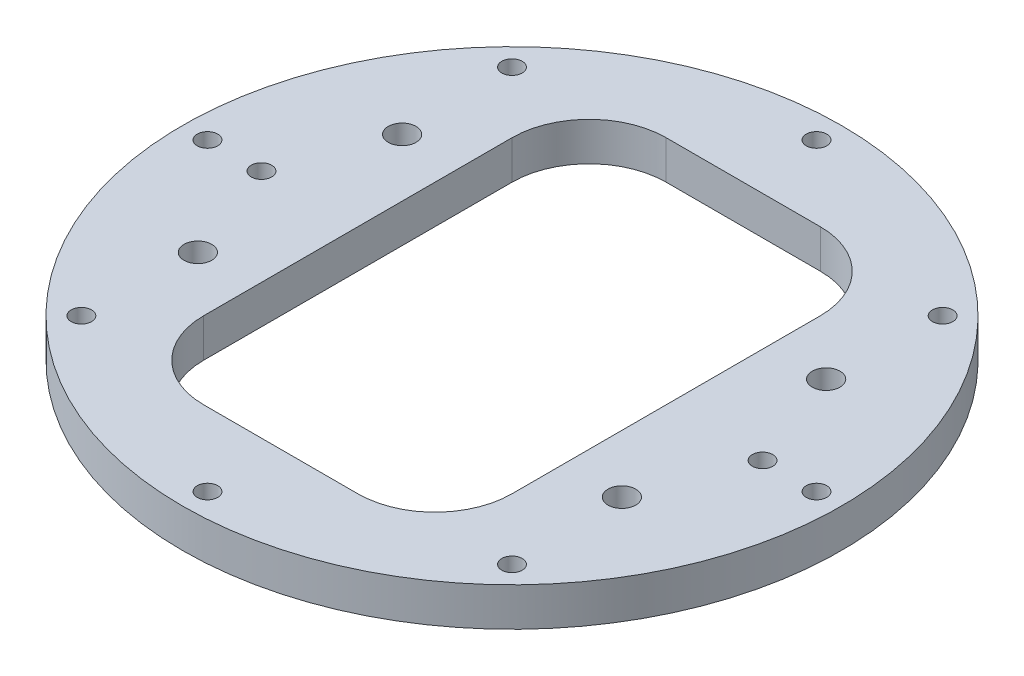
ISO-10303-21;
HEADER;
FILE_DESCRIPTION(('STEP AP214'),'2;1');
FILE_NAME('part.step','',(''),(''),'','','');
FILE_SCHEMA(('AUTOMOTIVE_DESIGN { 1 0 10303 214 1 1 1 1 }'));
ENDSEC;
DATA;
#1=APPLICATION_CONTEXT('core data for automotive mechanical design processes');
#2=APPLICATION_PROTOCOL_DEFINITION('international standard','automotive_design',2000,#1);
#3=PRODUCT_CONTEXT('',#1,'mechanical');
#4=PRODUCT('Part','Part','',(#3));
#5=PRODUCT_RELATED_PRODUCT_CATEGORY('part','',(#4));
#6=PRODUCT_DEFINITION_FORMATION('','',#4);
#7=PRODUCT_DEFINITION_CONTEXT('part definition',#1,'design');
#8=PRODUCT_DEFINITION('design','',#6,#7);
#9=PRODUCT_DEFINITION_SHAPE('','',#8);
#10=(LENGTH_UNIT() NAMED_UNIT(*) SI_UNIT(.MILLI.,.METRE.));
#11=(NAMED_UNIT(*) PLANE_ANGLE_UNIT() SI_UNIT($,.RADIAN.));
#12=(NAMED_UNIT(*) SI_UNIT($,.STERADIAN.) SOLID_ANGLE_UNIT());
#13=UNCERTAINTY_MEASURE_WITH_UNIT(LENGTH_MEASURE(1.E-05),#10,'distance_accuracy_value','');
#14=(GEOMETRIC_REPRESENTATION_CONTEXT(3) GLOBAL_UNCERTAINTY_ASSIGNED_CONTEXT((#13)) GLOBAL_UNIT_ASSIGNED_CONTEXT((#10,
#11,#12)) REPRESENTATION_CONTEXT('',''));
#15=CARTESIAN_POINT('',(0.,0.,0.));
#16=DIRECTION('',(0.,0.,1.));
#17=DIRECTION('',(1.,0.,0.));
#18=AXIS2_PLACEMENT_3D('',#15,#16,#17);
#19=CARTESIAN_POINT('',(0.,10.,0.));
#20=DIRECTION('',(0.,1.,0.));
#21=DIRECTION('',(0.,0.,1.));
#22=AXIS2_PLACEMENT_3D('',#19,#20,#21);
#23=PLANE('',#22);
#24=DIRECTION('',(0.,0.,-1.));
#25=VECTOR('',#24,1.);
#26=CARTESIAN_POINT('',(40.,10.,0.));
#27=LINE('',#26,#25);
#28=CARTESIAN_POINT('',(40.,10.,40.));
#29=VERTEX_POINT('',#28);
#30=CARTESIAN_POINT('',(40.,10.,-40.));
#31=VERTEX_POINT('',#30);
#32=EDGE_CURVE('E206',#29,#31,#27,.T.);
#33=ORIENTED_EDGE('',*,*,#32,.F.);
#34=CARTESIAN_POINT('',(20.,10.,40.));
#35=DIRECTION('',(0.,1.,0.));
#36=DIRECTION('',(0.,0.,1.));
#37=AXIS2_PLACEMENT_3D('',#34,#35,#36);
#38=CIRCLE('',#37,20.);
#39=CARTESIAN_POINT('',(20.,10.,60.));
#40=VERTEX_POINT('',#39);
#41=EDGE_CURVE('E119',#29,#40,#38,.F.);
#42=ORIENTED_EDGE('',*,*,#41,.T.);
#43=DIRECTION('',(1.,0.,0.));
#44=VECTOR('',#43,1.);
#45=CARTESIAN_POINT('',(-40.,10.,60.));
#46=LINE('',#45,#44);
#47=CARTESIAN_POINT('',(-20.,10.,60.));
#48=VERTEX_POINT('',#47);
#49=EDGE_CURVE('E169',#48,#40,#46,.T.);
#50=ORIENTED_EDGE('',*,*,#49,.F.);
#51=CARTESIAN_POINT('',(-20.,10.,40.));
#52=DIRECTION('',(0.,1.,0.));
#53=DIRECTION('',(0.,0.,1.));
#54=AXIS2_PLACEMENT_3D('',#51,#52,#53);
#55=CIRCLE('',#54,20.);
#56=CARTESIAN_POINT('',(-40.,10.,40.));
#57=VERTEX_POINT('',#56);
#58=EDGE_CURVE('E118',#48,#57,#55,.F.);
#59=ORIENTED_EDGE('',*,*,#58,.T.);
#60=DIRECTION('',(0.,0.,-1.));
#61=VECTOR('',#60,1.);
#62=CARTESIAN_POINT('',(-40.,10.,0.));
#63=LINE('',#62,#61);
#64=CARTESIAN_POINT('',(-40.,10.,-40.));
#65=VERTEX_POINT('',#64);
#66=EDGE_CURVE('E164',#57,#65,#63,.T.);
#67=ORIENTED_EDGE('',*,*,#66,.T.);
#68=CARTESIAN_POINT('',(-20.,10.,-40.));
#69=DIRECTION('',(0.,1.,0.));
#70=DIRECTION('',(0.,0.,1.));
#71=AXIS2_PLACEMENT_3D('',#68,#69,#70);
#72=CIRCLE('',#71,20.);
#73=CARTESIAN_POINT('',(-20.,10.,-60.));
#74=VERTEX_POINT('',#73);
#75=EDGE_CURVE('E50',#65,#74,#72,.F.);
#76=ORIENTED_EDGE('',*,*,#75,.T.);
#77=DIRECTION('',(-1.,0.,0.));
#78=VECTOR('',#77,1.);
#79=CARTESIAN_POINT('',(-40.,10.,-60.));
#80=LINE('',#79,#78);
#81=CARTESIAN_POINT('',(20.,10.,-60.));
#82=VERTEX_POINT('',#81);
#83=EDGE_CURVE('E162',#82,#74,#80,.T.);
#84=ORIENTED_EDGE('',*,*,#83,.F.);
#85=CARTESIAN_POINT('',(20.,10.,-40.));
#86=DIRECTION('',(0.,1.,0.));
#87=DIRECTION('',(0.,0.,1.));
#88=AXIS2_PLACEMENT_3D('',#85,#86,#87);
#89=CIRCLE('',#88,20.);
#90=EDGE_CURVE('E156',#82,#31,#89,.F.);
#91=ORIENTED_EDGE('',*,*,#90,.T.);
#92=EDGE_LOOP('',(#33,#42,#50,#59,#67,#76,#84,#91));
#93=FACE_BOUND('',#92,.T.);
#94=CARTESIAN_POINT('',(-65.,10.,4.44089209850063E-13));
#95=DIRECTION('',(0.,1.,0.));
#96=DIRECTION('',(0.,0.,1.));
#97=AXIS2_PLACEMENT_3D('',#94,#95,#96);
#98=CIRCLE('',#97,2.65);
#99=CARTESIAN_POINT('',(-65.,10.,2.65000000000044));
#100=VERTEX_POINT('',#99);
#101=EDGE_CURVE('E304',#100,#100,#98,.F.);
#102=ORIENTED_EDGE('',*,*,#101,.T.);
#103=EDGE_LOOP('',(#102));
#104=FACE_BOUND('',#103,.T.);
#105=CARTESIAN_POINT('',(-55.,10.,-26.5));
#106=DIRECTION('',(0.,-1.,0.));
#107=DIRECTION('',(0.,0.,-1.));
#108=AXIS2_PLACEMENT_3D('',#105,#106,#107);
#109=CIRCLE('',#108,3.60000000000002);
#110=CARTESIAN_POINT('',(-55.,10.,-30.1));
#111=VERTEX_POINT('',#110);
#112=EDGE_CURVE('E308',#111,#111,#109,.T.);
#113=ORIENTED_EDGE('',*,*,#112,.T.);
#114=EDGE_LOOP('',(#113));
#115=FACE_BOUND('',#114,.T.);
#116=CARTESIAN_POINT('',(55.,10.,26.5));
#117=DIRECTION('',(0.,1.,0.));
#118=DIRECTION('',(0.,0.,1.));
#119=AXIS2_PLACEMENT_3D('',#116,#117,#118);
#120=CIRCLE('',#119,3.6);
#121=CARTESIAN_POINT('',(55.,10.,30.1));
#122=VERTEX_POINT('',#121);
#123=EDGE_CURVE('E321',#122,#122,#120,.F.);
#124=ORIENTED_EDGE('',*,*,#123,.T.);
#125=EDGE_LOOP('',(#124));
#126=FACE_BOUND('',#125,.T.);
#127=CARTESIAN_POINT('',(0.,10.,-79.));
#128=DIRECTION('',(0.,1.,0.));
#129=DIRECTION('',(0.,0.,1.));
#130=AXIS2_PLACEMENT_3D('',#127,#128,#129);
#131=CIRCLE('',#130,2.65);
#132=CARTESIAN_POINT('',(0.,10.,-76.35));
#133=VERTEX_POINT('',#132);
#134=EDGE_CURVE('E210',#133,#133,#131,.T.);
#135=ORIENTED_EDGE('',*,*,#134,.F.);
#136=EDGE_LOOP('',(#135));
#137=FACE_BOUND('',#136,.T.);
#138=CARTESIAN_POINT('',(-55.8614357137366,10.,-55.8614357137379));
#139=DIRECTION('',(0.,1.,0.));
#140=DIRECTION('',(0.,0.,1.));
#141=AXIS2_PLACEMENT_3D('',#138,#139,#140);
#142=CIRCLE('',#141,2.65);
#143=CARTESIAN_POINT('',(-55.8614357137366,10.,-53.2114357137379));
#144=VERTEX_POINT('',#143);
#145=EDGE_CURVE('E218',#144,#144,#142,.T.);
#146=ORIENTED_EDGE('',*,*,#145,.F.);
#147=EDGE_LOOP('',(#146));
#148=FACE_BOUND('',#147,.T.);
#149=CARTESIAN_POINT('',(-79.,10.,-8.27481077305822E-13));
#150=DIRECTION('',(0.,1.,0.));
#151=DIRECTION('',(0.,0.,1.));
#152=AXIS2_PLACEMENT_3D('',#149,#150,#151);
#153=CIRCLE('',#152,2.65);
#154=CARTESIAN_POINT('',(-79.,10.,2.64999999999917));
#155=VERTEX_POINT('',#154);
#156=EDGE_CURVE('E221',#155,#155,#153,.T.);
#157=ORIENTED_EDGE('',*,*,#156,.F.);
#158=EDGE_LOOP('',(#157));
#159=FACE_BOUND('',#158,.T.);
#160=CARTESIAN_POINT('',(-55.8614357137377,10.,55.8614357137368));
#161=DIRECTION('',(0.,1.,0.));
#162=DIRECTION('',(0.,0.,1.));
#163=AXIS2_PLACEMENT_3D('',#160,#161,#162);
#164=CIRCLE('',#163,2.65);
#165=CARTESIAN_POINT('',(-55.8614357137377,10.,58.5114357137368));
#166=VERTEX_POINT('',#165);
#167=EDGE_CURVE('E224',#166,#166,#164,.T.);
#168=ORIENTED_EDGE('',*,*,#167,.F.);
#169=EDGE_LOOP('',(#168));
#170=FACE_BOUND('',#169,.T.);
#171=CARTESIAN_POINT('',(-5.51654051537215E-13,10.,79.));
#172=DIRECTION('',(0.,1.,0.));
#173=DIRECTION('',(0.,0.,1.));
#174=AXIS2_PLACEMENT_3D('',#171,#172,#173);
#175=CIRCLE('',#174,2.65);
#176=CARTESIAN_POINT('',(-5.51654051537215E-13,10.,81.65));
#177=VERTEX_POINT('',#176);
#178=EDGE_CURVE('E227',#177,#177,#175,.T.);
#179=ORIENTED_EDGE('',*,*,#178,.F.);
#180=EDGE_LOOP('',(#179));
#181=FACE_BOUND('',#180,.T.);
#182=CARTESIAN_POINT('',(55.861435713737,10.,55.8614357137375));
#183=DIRECTION('',(0.,1.,0.));
#184=DIRECTION('',(0.,0.,1.));
#185=AXIS2_PLACEMENT_3D('',#182,#183,#184);
#186=CIRCLE('',#185,2.65);
#187=CARTESIAN_POINT('',(55.861435713737,10.,58.5114357137375));
#188=VERTEX_POINT('',#187);
#189=EDGE_CURVE('E230',#188,#188,#186,.T.);
#190=ORIENTED_EDGE('',*,*,#189,.F.);
#191=EDGE_LOOP('',(#190));
#192=FACE_BOUND('',#191,.T.);
#193=CARTESIAN_POINT('',(79.,10.,2.75827025768607E-13));
#194=DIRECTION('',(0.,1.,0.));
#195=DIRECTION('',(0.,0.,1.));
#196=AXIS2_PLACEMENT_3D('',#193,#194,#195);
#197=CIRCLE('',#196,2.65);
#198=CARTESIAN_POINT('',(79.,10.,2.65000000000027));
#199=VERTEX_POINT('',#198);
#200=EDGE_CURVE('E233',#199,#199,#197,.T.);
#201=ORIENTED_EDGE('',*,*,#200,.F.);
#202=EDGE_LOOP('',(#201));
#203=FACE_BOUND('',#202,.T.);
#204=CARTESIAN_POINT('',(55.8614357137374,10.,-55.8614357137372));
#205=DIRECTION('',(0.,1.,0.));
#206=DIRECTION('',(0.,0.,1.));
#207=AXIS2_PLACEMENT_3D('',#204,#205,#206);
#208=CIRCLE('',#207,2.65);
#209=CARTESIAN_POINT('',(55.8614357137374,10.,-53.2114357137371));
#210=VERTEX_POINT('',#209);
#211=EDGE_CURVE('E236',#210,#210,#208,.T.);
#212=ORIENTED_EDGE('',*,*,#211,.F.);
#213=EDGE_LOOP('',(#212));
#214=FACE_BOUND('',#213,.T.);
#215=CARTESIAN_POINT('',(0.,10.,0.));
#216=DIRECTION('',(0.,1.,0.));
#217=DIRECTION('',(0.,0.,1.));
#218=AXIS2_PLACEMENT_3D('',#215,#216,#217);
#219=CIRCLE('',#218,85.5);
#220=CARTESIAN_POINT('',(0.,10.,85.5));
#221=VERTEX_POINT('',#220);
#222=EDGE_CURVE('E138',#221,#221,#219,.T.);
#223=ORIENTED_EDGE('',*,*,#222,.T.);
#224=EDGE_LOOP('',(#223));
#225=FACE_BOUND('',#224,.T.);
#226=CARTESIAN_POINT('',(65.,10.,0.));
#227=DIRECTION('',(0.,1.,0.));
#228=DIRECTION('',(0.,0.,1.));
#229=AXIS2_PLACEMENT_3D('',#226,#227,#228);
#230=CIRCLE('',#229,2.65);
#231=CARTESIAN_POINT('',(65.,10.,2.65));
#232=VERTEX_POINT('',#231);
#233=EDGE_CURVE('E315',#232,#232,#230,.T.);
#234=ORIENTED_EDGE('',*,*,#233,.F.);
#235=EDGE_LOOP('',(#234));
#236=FACE_BOUND('',#235,.T.);
#237=CARTESIAN_POINT('',(55.,10.,-26.5));
#238=DIRECTION('',(0.,1.,0.));
#239=DIRECTION('',(0.,0.,1.));
#240=AXIS2_PLACEMENT_3D('',#237,#238,#239);
#241=CIRCLE('',#240,3.6);
#242=CARTESIAN_POINT('',(55.,10.,-22.9));
#243=VERTEX_POINT('',#242);
#244=EDGE_CURVE('E330',#243,#243,#241,.T.);
#245=ORIENTED_EDGE('',*,*,#244,.F.);
#246=EDGE_LOOP('',(#245));
#247=FACE_BOUND('',#246,.T.);
#248=CARTESIAN_POINT('',(-55.,10.,26.5));
#249=DIRECTION('',(0.,1.,0.));
#250=DIRECTION('',(0.,0.,1.));
#251=AXIS2_PLACEMENT_3D('',#248,#249,#250);
#252=CIRCLE('',#251,3.6);
#253=CARTESIAN_POINT('',(-55.,10.,30.1));
#254=VERTEX_POINT('',#253);
#255=EDGE_CURVE('E307',#254,#254,#252,.T.);
#256=ORIENTED_EDGE('',*,*,#255,.F.);
#257=EDGE_LOOP('',(#256));
#258=FACE_BOUND('',#257,.T.);
#259=ADVANCED_FACE('F42',(#93,#104,#115,#126,#137,#148,#159,#170,#181,#192,#203,#214,#225,#236,
#247,#258),#23,.T.);
#260=CARTESIAN_POINT('',(0.,0.,0.));
#261=DIRECTION('',(0.,1.,0.));
#262=DIRECTION('',(0.,0.,1.));
#263=AXIS2_PLACEMENT_3D('',#260,#261,#262);
#264=PLANE('',#263);
#265=DIRECTION('',(0.,0.,-1.));
#266=VECTOR('',#265,1.);
#267=CARTESIAN_POINT('',(-40.,0.,0.));
#268=LINE('',#267,#266);
#269=CARTESIAN_POINT('',(-40.,0.,40.));
#270=VERTEX_POINT('',#269);
#271=CARTESIAN_POINT('',(-40.,0.,-40.));
#272=VERTEX_POINT('',#271);
#273=EDGE_CURVE('E129',#270,#272,#268,.T.);
#274=ORIENTED_EDGE('',*,*,#273,.F.);
#275=CARTESIAN_POINT('',(-20.,0.,40.));
#276=DIRECTION('',(0.,1.,0.));
#277=DIRECTION('',(0.,0.,1.));
#278=AXIS2_PLACEMENT_3D('',#275,#276,#277);
#279=CIRCLE('',#278,20.);
#280=CARTESIAN_POINT('',(-20.,0.,60.));
#281=VERTEX_POINT('',#280);
#282=EDGE_CURVE('E154',#270,#281,#279,.T.);
#283=ORIENTED_EDGE('',*,*,#282,.T.);
#284=DIRECTION('',(1.,0.,0.));
#285=VECTOR('',#284,1.);
#286=CARTESIAN_POINT('',(-40.,0.,60.));
#287=LINE('',#286,#285);
#288=CARTESIAN_POINT('',(20.,0.,60.));
#289=VERTEX_POINT('',#288);
#290=EDGE_CURVE('E114',#281,#289,#287,.T.);
#291=ORIENTED_EDGE('',*,*,#290,.T.);
#292=CARTESIAN_POINT('',(20.,0.,40.));
#293=DIRECTION('',(0.,1.,0.));
#294=DIRECTION('',(0.,0.,1.));
#295=AXIS2_PLACEMENT_3D('',#292,#293,#294);
#296=CIRCLE('',#295,20.);
#297=CARTESIAN_POINT('',(40.,0.,40.));
#298=VERTEX_POINT('',#297);
#299=EDGE_CURVE('E107',#289,#298,#296,.T.);
#300=ORIENTED_EDGE('',*,*,#299,.T.);
#301=DIRECTION('',(0.,0.,-1.));
#302=VECTOR('',#301,1.);
#303=CARTESIAN_POINT('',(40.,0.,0.));
#304=LINE('',#303,#302);
#305=CARTESIAN_POINT('',(40.,0.,-40.));
#306=VERTEX_POINT('',#305);
#307=EDGE_CURVE('E112',#298,#306,#304,.T.);
#308=ORIENTED_EDGE('',*,*,#307,.T.);
#309=CARTESIAN_POINT('',(20.,0.,-40.));
#310=DIRECTION('',(0.,1.,0.));
#311=DIRECTION('',(0.,0.,1.));
#312=AXIS2_PLACEMENT_3D('',#309,#310,#311);
#313=CIRCLE('',#312,20.);
#314=CARTESIAN_POINT('',(20.,0.,-60.));
#315=VERTEX_POINT('',#314);
#316=EDGE_CURVE('E64',#306,#315,#313,.T.);
#317=ORIENTED_EDGE('',*,*,#316,.T.);
#318=DIRECTION('',(-1.,0.,0.));
#319=VECTOR('',#318,1.);
#320=CARTESIAN_POINT('',(-40.,0.,-60.));
#321=LINE('',#320,#319);
#322=CARTESIAN_POINT('',(-20.,0.,-60.));
#323=VERTEX_POINT('',#322);
#324=EDGE_CURVE('E174',#315,#323,#321,.T.);
#325=ORIENTED_EDGE('',*,*,#324,.T.);
#326=CARTESIAN_POINT('',(-20.,0.,-40.));
#327=DIRECTION('',(0.,1.,0.));
#328=DIRECTION('',(0.,0.,1.));
#329=AXIS2_PLACEMENT_3D('',#326,#327,#328);
#330=CIRCLE('',#329,20.);
#331=EDGE_CURVE('E11',#323,#272,#330,.T.);
#332=ORIENTED_EDGE('',*,*,#331,.T.);
#333=EDGE_LOOP('',(#274,#283,#291,#300,#308,#317,#325,#332));
#334=FACE_BOUND('',#333,.T.);
#335=CARTESIAN_POINT('',(-65.,0.,4.44089209850063E-13));
#336=DIRECTION('',(0.,1.,0.));
#337=DIRECTION('',(0.,0.,1.));
#338=AXIS2_PLACEMENT_3D('',#335,#336,#337);
#339=CIRCLE('',#338,2.65);
#340=CARTESIAN_POINT('',(-65.,0.,2.65000000000044));
#341=VERTEX_POINT('',#340);
#342=EDGE_CURVE('E130',#341,#341,#339,.F.);
#343=ORIENTED_EDGE('',*,*,#342,.F.);
#344=EDGE_LOOP('',(#343));
#345=FACE_BOUND('',#344,.T.);
#346=CARTESIAN_POINT('',(-55.,0.,-26.5));
#347=DIRECTION('',(0.,-1.,0.));
#348=DIRECTION('',(0.,0.,-1.));
#349=AXIS2_PLACEMENT_3D('',#346,#347,#348);
#350=CIRCLE('',#349,3.60000000000002);
#351=CARTESIAN_POINT('',(-55.,0.,-30.1));
#352=VERTEX_POINT('',#351);
#353=EDGE_CURVE('E312',#352,#352,#350,.T.);
#354=ORIENTED_EDGE('',*,*,#353,.F.);
#355=EDGE_LOOP('',(#354));
#356=FACE_BOUND('',#355,.T.);
#357=CARTESIAN_POINT('',(55.,0.,-26.5));
#358=DIRECTION('',(0.,1.,0.));
#359=DIRECTION('',(0.,0.,1.));
#360=AXIS2_PLACEMENT_3D('',#357,#358,#359);
#361=CIRCLE('',#360,3.6);
#362=CARTESIAN_POINT('',(55.,0.,-22.9));
#363=VERTEX_POINT('',#362);
#364=EDGE_CURVE('E213',#363,#363,#361,.T.);
#365=ORIENTED_EDGE('',*,*,#364,.T.);
#366=EDGE_LOOP('',(#365));
#367=FACE_BOUND('',#366,.T.);
#368=CARTESIAN_POINT('',(0.,0.,0.));
#369=DIRECTION('',(0.,1.,0.));
#370=DIRECTION('',(0.,0.,1.));
#371=AXIS2_PLACEMENT_3D('',#368,#369,#370);
#372=CIRCLE('',#371,85.5);
#373=CARTESIAN_POINT('',(0.,0.,85.5));
#374=VERTEX_POINT('',#373);
#375=EDGE_CURVE('E204',#374,#374,#372,.T.);
#376=ORIENTED_EDGE('',*,*,#375,.F.);
#377=EDGE_LOOP('',(#376));
#378=FACE_BOUND('',#377,.T.);
#379=CARTESIAN_POINT('',(55.8614357137374,0.,-55.8614357137372));
#380=DIRECTION('',(0.,1.,0.));
#381=DIRECTION('',(0.,0.,1.));
#382=AXIS2_PLACEMENT_3D('',#379,#380,#381);
#383=CIRCLE('',#382,2.65);
#384=CARTESIAN_POINT('',(55.8614357137374,0.,-53.2114357137371));
#385=VERTEX_POINT('',#384);
#386=EDGE_CURVE('E202',#385,#385,#383,.T.);
#387=ORIENTED_EDGE('',*,*,#386,.T.);
#388=EDGE_LOOP('',(#387));
#389=FACE_BOUND('',#388,.T.);
#390=CARTESIAN_POINT('',(79.,0.,2.75827025768607E-13));
#391=DIRECTION('',(0.,1.,0.));
#392=DIRECTION('',(0.,0.,1.));
#393=AXIS2_PLACEMENT_3D('',#390,#391,#392);
#394=CIRCLE('',#393,2.65);
#395=CARTESIAN_POINT('',(79.,0.,2.65000000000027));
#396=VERTEX_POINT('',#395);
#397=EDGE_CURVE('E199',#396,#396,#394,.T.);
#398=ORIENTED_EDGE('',*,*,#397,.T.);
#399=EDGE_LOOP('',(#398));
#400=FACE_BOUND('',#399,.T.);
#401=CARTESIAN_POINT('',(55.861435713737,0.,55.8614357137375));
#402=DIRECTION('',(0.,1.,0.));
#403=DIRECTION('',(0.,0.,1.));
#404=AXIS2_PLACEMENT_3D('',#401,#402,#403);
#405=CIRCLE('',#404,2.65);
#406=CARTESIAN_POINT('',(55.861435713737,0.,58.5114357137375));
#407=VERTEX_POINT('',#406);
#408=EDGE_CURVE('E196',#407,#407,#405,.T.);
#409=ORIENTED_EDGE('',*,*,#408,.T.);
#410=EDGE_LOOP('',(#409));
#411=FACE_BOUND('',#410,.T.);
#412=CARTESIAN_POINT('',(-5.51654051537215E-13,0.,79.));
#413=DIRECTION('',(0.,1.,0.));
#414=DIRECTION('',(0.,0.,1.));
#415=AXIS2_PLACEMENT_3D('',#412,#413,#414);
#416=CIRCLE('',#415,2.65);
#417=CARTESIAN_POINT('',(-5.51654051537215E-13,0.,81.65));
#418=VERTEX_POINT('',#417);
#419=EDGE_CURVE('E193',#418,#418,#416,.T.);
#420=ORIENTED_EDGE('',*,*,#419,.T.);
#421=EDGE_LOOP('',(#420));
#422=FACE_BOUND('',#421,.T.);
#423=CARTESIAN_POINT('',(-55.8614357137377,0.,55.8614357137368));
#424=DIRECTION('',(0.,1.,0.));
#425=DIRECTION('',(0.,0.,1.));
#426=AXIS2_PLACEMENT_3D('',#423,#424,#425);
#427=CIRCLE('',#426,2.65);
#428=CARTESIAN_POINT('',(-55.8614357137377,0.,58.5114357137368));
#429=VERTEX_POINT('',#428);
#430=EDGE_CURVE('E190',#429,#429,#427,.T.);
#431=ORIENTED_EDGE('',*,*,#430,.T.);
#432=EDGE_LOOP('',(#431));
#433=FACE_BOUND('',#432,.T.);
#434=CARTESIAN_POINT('',(-79.,0.,-8.27481077305822E-13));
#435=DIRECTION('',(0.,1.,0.));
#436=DIRECTION('',(0.,0.,1.));
#437=AXIS2_PLACEMENT_3D('',#434,#435,#436);
#438=CIRCLE('',#437,2.65);
#439=CARTESIAN_POINT('',(-79.,0.,2.64999999999917));
#440=VERTEX_POINT('',#439);
#441=EDGE_CURVE('E187',#440,#440,#438,.T.);
#442=ORIENTED_EDGE('',*,*,#441,.T.);
#443=EDGE_LOOP('',(#442));
#444=FACE_BOUND('',#443,.T.);
#445=CARTESIAN_POINT('',(-55.8614357137366,0.,-55.8614357137379));
#446=DIRECTION('',(0.,1.,0.));
#447=DIRECTION('',(0.,0.,1.));
#448=AXIS2_PLACEMENT_3D('',#445,#446,#447);
#449=CIRCLE('',#448,2.65);
#450=CARTESIAN_POINT('',(-55.8614357137366,0.,-53.2114357137379));
#451=VERTEX_POINT('',#450);
#452=EDGE_CURVE('E181',#451,#451,#449,.T.);
#453=ORIENTED_EDGE('',*,*,#452,.T.);
#454=EDGE_LOOP('',(#453));
#455=FACE_BOUND('',#454,.T.);
#456=CARTESIAN_POINT('',(0.,0.,-79.));
#457=DIRECTION('',(0.,1.,0.));
#458=DIRECTION('',(0.,0.,1.));
#459=AXIS2_PLACEMENT_3D('',#456,#457,#458);
#460=CIRCLE('',#459,2.65);
#461=CARTESIAN_POINT('',(0.,0.,-76.35));
#462=VERTEX_POINT('',#461);
#463=EDGE_CURVE('E178',#462,#462,#460,.T.);
#464=ORIENTED_EDGE('',*,*,#463,.T.);
#465=EDGE_LOOP('',(#464));
#466=FACE_BOUND('',#465,.T.);
#467=CARTESIAN_POINT('',(55.,0.,26.5));
#468=DIRECTION('',(0.,1.,0.));
#469=DIRECTION('',(0.,0.,1.));
#470=AXIS2_PLACEMENT_3D('',#467,#468,#469);
#471=CIRCLE('',#470,3.6);
#472=CARTESIAN_POINT('',(55.,0.,30.1));
#473=VERTEX_POINT('',#472);
#474=EDGE_CURVE('E311',#473,#473,#471,.F.);
#475=ORIENTED_EDGE('',*,*,#474,.F.);
#476=EDGE_LOOP('',(#475));
#477=FACE_BOUND('',#476,.T.);
#478=CARTESIAN_POINT('',(65.,0.,0.));
#479=DIRECTION('',(0.,1.,0.));
#480=DIRECTION('',(0.,0.,1.));
#481=AXIS2_PLACEMENT_3D('',#478,#479,#480);
#482=CIRCLE('',#481,2.65);
#483=CARTESIAN_POINT('',(65.,0.,2.65));
#484=VERTEX_POINT('',#483);
#485=EDGE_CURVE('E318',#484,#484,#482,.T.);
#486=ORIENTED_EDGE('',*,*,#485,.T.);
#487=EDGE_LOOP('',(#486));
#488=FACE_BOUND('',#487,.T.);
#489=CARTESIAN_POINT('',(-55.,0.,26.5));
#490=DIRECTION('',(0.,1.,0.));
#491=DIRECTION('',(0.,0.,1.));
#492=AXIS2_PLACEMENT_3D('',#489,#490,#491);
#493=CIRCLE('',#492,3.6);
#494=CARTESIAN_POINT('',(-55.,0.,30.1));
#495=VERTEX_POINT('',#494);
#496=EDGE_CURVE('E328',#495,#495,#493,.T.);
#497=ORIENTED_EDGE('',*,*,#496,.T.);
#498=EDGE_LOOP('',(#497));
#499=FACE_BOUND('',#498,.T.);
#500=ADVANCED_FACE('F110',(#334,#345,#356,#367,#378,#389,#400,#411,#422,#433,#444,#455,#466,
#477,#488,#499),#264,.F.);
#501=CARTESIAN_POINT('',(40.,10.,0.));
#502=DIRECTION('',(-1.,0.,0.));
#503=DIRECTION('',(0.,0.,1.));
#504=AXIS2_PLACEMENT_3D('',#501,#502,#503);
#505=PLANE('',#504);
#506=ORIENTED_EDGE('',*,*,#307,.F.);
#507=DIRECTION('',(0.,1.,0.));
#508=VECTOR('',#507,1.);
#509=CARTESIAN_POINT('',(40.,10.,40.));
#510=LINE('',#509,#508);
#511=EDGE_CURVE('E125',#298,#29,#510,.T.);
#512=ORIENTED_EDGE('',*,*,#511,.T.);
#513=ORIENTED_EDGE('',*,*,#32,.T.);
#514=DIRECTION('',(0.,1.,0.));
#515=VECTOR('',#514,1.);
#516=CARTESIAN_POINT('',(40.,10.,-40.));
#517=LINE('',#516,#515);
#518=EDGE_CURVE('E128',#31,#306,#517,.F.);
#519=ORIENTED_EDGE('',*,*,#518,.T.);
#520=EDGE_LOOP('',(#506,#512,#513,#519));
#521=FACE_BOUND('',#520,.T.);
#522=ADVANCED_FACE('F123',(#521),#505,.T.);
#523=CARTESIAN_POINT('',(-40.,10.,0.));
#524=DIRECTION('',(-1.,0.,0.));
#525=DIRECTION('',(0.,0.,1.));
#526=AXIS2_PLACEMENT_3D('',#523,#524,#525);
#527=PLANE('',#526);
#528=ORIENTED_EDGE('',*,*,#66,.F.);
#529=DIRECTION('',(0.,1.,0.));
#530=VECTOR('',#529,1.);
#531=CARTESIAN_POINT('',(-40.,0.,40.));
#532=LINE('',#531,#530);
#533=EDGE_CURVE('E146',#57,#270,#532,.F.);
#534=ORIENTED_EDGE('',*,*,#533,.T.);
#535=ORIENTED_EDGE('',*,*,#273,.T.);
#536=DIRECTION('',(0.,1.,0.));
#537=VECTOR('',#536,1.);
#538=CARTESIAN_POINT('',(-40.,10.,-40.));
#539=LINE('',#538,#537);
#540=EDGE_CURVE('E143',#272,#65,#539,.T.);
#541=ORIENTED_EDGE('',*,*,#540,.T.);
#542=EDGE_LOOP('',(#528,#534,#535,#541));
#543=FACE_BOUND('',#542,.T.);
#544=ADVANCED_FACE('F176',(#543),#527,.F.);
#545=CARTESIAN_POINT('',(55.8614357137374,10.,-55.8614357137372));
#546=DIRECTION('',(0.,-1.,0.));
#547=DIRECTION('',(0.,0.,-1.));
#548=AXIS2_PLACEMENT_3D('',#545,#546,#547);
#549=CYLINDRICAL_SURFACE('',#548,2.65);
#550=ORIENTED_EDGE('',*,*,#211,.T.);
#551=EDGE_LOOP('',(#550));
#552=FACE_BOUND('',#551,.T.);
#553=ORIENTED_EDGE('',*,*,#386,.F.);
#554=EDGE_LOOP('',(#553));
#555=FACE_BOUND('',#554,.T.);
#556=ADVANCED_FACE('F386',(#552,#555),#549,.F.);
#557=CARTESIAN_POINT('',(79.,10.,2.75827025768607E-13));
#558=DIRECTION('',(0.,-1.,0.));
#559=DIRECTION('',(0.,0.,-1.));
#560=AXIS2_PLACEMENT_3D('',#557,#558,#559);
#561=CYLINDRICAL_SURFACE('',#560,2.65);
#562=ORIENTED_EDGE('',*,*,#200,.T.);
#563=EDGE_LOOP('',(#562));
#564=FACE_BOUND('',#563,.T.);
#565=ORIENTED_EDGE('',*,*,#397,.F.);
#566=EDGE_LOOP('',(#565));
#567=FACE_BOUND('',#566,.T.);
#568=ADVANCED_FACE('F389',(#564,#567),#561,.F.);
#569=CARTESIAN_POINT('',(55.861435713737,10.,55.8614357137375));
#570=DIRECTION('',(0.,-1.,0.));
#571=DIRECTION('',(0.,0.,-1.));
#572=AXIS2_PLACEMENT_3D('',#569,#570,#571);
#573=CYLINDRICAL_SURFACE('',#572,2.65);
#574=ORIENTED_EDGE('',*,*,#189,.T.);
#575=EDGE_LOOP('',(#574));
#576=FACE_BOUND('',#575,.T.);
#577=ORIENTED_EDGE('',*,*,#408,.F.);
#578=EDGE_LOOP('',(#577));
#579=FACE_BOUND('',#578,.T.);
#580=ADVANCED_FACE('F393',(#576,#579),#573,.F.);
#581=CARTESIAN_POINT('',(-5.51654051537215E-13,10.,79.));
#582=DIRECTION('',(0.,-1.,0.));
#583=DIRECTION('',(0.,0.,-1.));
#584=AXIS2_PLACEMENT_3D('',#581,#582,#583);
#585=CYLINDRICAL_SURFACE('',#584,2.65);
#586=ORIENTED_EDGE('',*,*,#178,.T.);
#587=EDGE_LOOP('',(#586));
#588=FACE_BOUND('',#587,.T.);
#589=ORIENTED_EDGE('',*,*,#419,.F.);
#590=EDGE_LOOP('',(#589));
#591=FACE_BOUND('',#590,.T.);
#592=ADVANCED_FACE('F401',(#588,#591),#585,.F.);
#593=CARTESIAN_POINT('',(-55.8614357137377,10.,55.8614357137368));
#594=DIRECTION('',(0.,-1.,0.));
#595=DIRECTION('',(0.,0.,-1.));
#596=AXIS2_PLACEMENT_3D('',#593,#594,#595);
#597=CYLINDRICAL_SURFACE('',#596,2.65);
#598=ORIENTED_EDGE('',*,*,#167,.T.);
#599=EDGE_LOOP('',(#598));
#600=FACE_BOUND('',#599,.T.);
#601=ORIENTED_EDGE('',*,*,#430,.F.);
#602=EDGE_LOOP('',(#601));
#603=FACE_BOUND('',#602,.T.);
#604=ADVANCED_FACE('F405',(#600,#603),#597,.F.);
#605=CARTESIAN_POINT('',(-79.,10.,-8.27481077305822E-13));
#606=DIRECTION('',(0.,-1.,0.));
#607=DIRECTION('',(0.,0.,-1.));
#608=AXIS2_PLACEMENT_3D('',#605,#606,#607);
#609=CYLINDRICAL_SURFACE('',#608,2.65);
#610=ORIENTED_EDGE('',*,*,#156,.T.);
#611=EDGE_LOOP('',(#610));
#612=FACE_BOUND('',#611,.T.);
#613=ORIENTED_EDGE('',*,*,#441,.F.);
#614=EDGE_LOOP('',(#613));
#615=FACE_BOUND('',#614,.T.);
#616=ADVANCED_FACE('F409',(#612,#615),#609,.F.);
#617=CARTESIAN_POINT('',(-55.8614357137366,10.,-55.8614357137379));
#618=DIRECTION('',(0.,-1.,0.));
#619=DIRECTION('',(0.,0.,-1.));
#620=AXIS2_PLACEMENT_3D('',#617,#618,#619);
#621=CYLINDRICAL_SURFACE('',#620,2.65);
#622=ORIENTED_EDGE('',*,*,#145,.T.);
#623=EDGE_LOOP('',(#622));
#624=FACE_BOUND('',#623,.T.);
#625=ORIENTED_EDGE('',*,*,#452,.F.);
#626=EDGE_LOOP('',(#625));
#627=FACE_BOUND('',#626,.T.);
#628=ADVANCED_FACE('F255',(#624,#627),#621,.F.);
#629=CARTESIAN_POINT('',(0.,10.,-79.));
#630=DIRECTION('',(0.,-1.,0.));
#631=DIRECTION('',(0.,0.,-1.));
#632=AXIS2_PLACEMENT_3D('',#629,#630,#631);
#633=CYLINDRICAL_SURFACE('',#632,2.65);
#634=ORIENTED_EDGE('',*,*,#134,.T.);
#635=EDGE_LOOP('',(#634));
#636=FACE_BOUND('',#635,.T.);
#637=ORIENTED_EDGE('',*,*,#463,.F.);
#638=EDGE_LOOP('',(#637));
#639=FACE_BOUND('',#638,.T.);
#640=ADVANCED_FACE('F246',(#636,#639),#633,.F.);
#641=CARTESIAN_POINT('',(0.,10.,0.));
#642=DIRECTION('',(0.,-1.,0.));
#643=DIRECTION('',(0.,0.,-1.));
#644=AXIS2_PLACEMENT_3D('',#641,#642,#643);
#645=CYLINDRICAL_SURFACE('',#644,85.5);
#646=ORIENTED_EDGE('',*,*,#222,.F.);
#647=EDGE_LOOP('',(#646));
#648=FACE_BOUND('',#647,.T.);
#649=ORIENTED_EDGE('',*,*,#375,.T.);
#650=EDGE_LOOP('',(#649));
#651=FACE_BOUND('',#650,.T.);
#652=ADVANCED_FACE('F243',(#648,#651),#645,.T.);
#653=CARTESIAN_POINT('',(55.,0.,26.5));
#654=DIRECTION('',(0.,1.,0.));
#655=DIRECTION('',(0.,0.,1.));
#656=AXIS2_PLACEMENT_3D('',#653,#654,#655);
#657=CYLINDRICAL_SURFACE('',#656,3.6);
#658=ORIENTED_EDGE('',*,*,#474,.T.);
#659=EDGE_LOOP('',(#658));
#660=FACE_BOUND('',#659,.T.);
#661=ORIENTED_EDGE('',*,*,#123,.F.);
#662=EDGE_LOOP('',(#661));
#663=FACE_BOUND('',#662,.T.);
#664=ADVANCED_FACE('F245',(#660,#663),#657,.F.);
#665=CARTESIAN_POINT('',(65.,0.,0.));
#666=DIRECTION('',(0.,1.,0.));
#667=DIRECTION('',(0.,0.,1.));
#668=AXIS2_PLACEMENT_3D('',#665,#666,#667);
#669=CYLINDRICAL_SURFACE('',#668,2.65);
#670=ORIENTED_EDGE('',*,*,#485,.F.);
#671=EDGE_LOOP('',(#670));
#672=FACE_BOUND('',#671,.T.);
#673=ORIENTED_EDGE('',*,*,#233,.T.);
#674=EDGE_LOOP('',(#673));
#675=FACE_BOUND('',#674,.T.);
#676=ADVANCED_FACE('F252',(#672,#675),#669,.F.);
#677=CARTESIAN_POINT('',(55.,0.,-26.5));
#678=DIRECTION('',(0.,1.,0.));
#679=DIRECTION('',(0.,0.,1.));
#680=AXIS2_PLACEMENT_3D('',#677,#678,#679);
#681=CYLINDRICAL_SURFACE('',#680,3.6);
#682=ORIENTED_EDGE('',*,*,#364,.F.);
#683=EDGE_LOOP('',(#682));
#684=FACE_BOUND('',#683,.T.);
#685=ORIENTED_EDGE('',*,*,#244,.T.);
#686=EDGE_LOOP('',(#685));
#687=FACE_BOUND('',#686,.T.);
#688=ADVANCED_FACE('F267',(#684,#687),#681,.F.);
#689=CARTESIAN_POINT('',(-55.,0.,26.5));
#690=DIRECTION('',(0.,1.,0.));
#691=DIRECTION('',(0.,0.,1.));
#692=AXIS2_PLACEMENT_3D('',#689,#690,#691);
#693=CYLINDRICAL_SURFACE('',#692,3.6);
#694=ORIENTED_EDGE('',*,*,#496,.F.);
#695=EDGE_LOOP('',(#694));
#696=FACE_BOUND('',#695,.T.);
#697=ORIENTED_EDGE('',*,*,#255,.T.);
#698=EDGE_LOOP('',(#697));
#699=FACE_BOUND('',#698,.T.);
#700=ADVANCED_FACE('F270',(#696,#699),#693,.F.);
#701=CARTESIAN_POINT('',(-55.,0.,-26.5));
#702=DIRECTION('',(0.,1.,0.));
#703=DIRECTION('',(0.,0.,1.));
#704=AXIS2_PLACEMENT_3D('',#701,#702,#703);
#705=CYLINDRICAL_SURFACE('',#704,3.60000000000002);
#706=ORIENTED_EDGE('',*,*,#353,.T.);
#707=EDGE_LOOP('',(#706));
#708=FACE_BOUND('',#707,.T.);
#709=ORIENTED_EDGE('',*,*,#112,.F.);
#710=EDGE_LOOP('',(#709));
#711=FACE_BOUND('',#710,.T.);
#712=ADVANCED_FACE('F273',(#708,#711),#705,.F.);
#713=CARTESIAN_POINT('',(-65.,0.,4.44089209850063E-13));
#714=DIRECTION('',(0.,1.,0.));
#715=DIRECTION('',(0.,0.,1.));
#716=AXIS2_PLACEMENT_3D('',#713,#714,#715);
#717=CYLINDRICAL_SURFACE('',#716,2.65);
#718=ORIENTED_EDGE('',*,*,#342,.T.);
#719=EDGE_LOOP('',(#718));
#720=FACE_BOUND('',#719,.T.);
#721=ORIENTED_EDGE('',*,*,#101,.F.);
#722=EDGE_LOOP('',(#721));
#723=FACE_BOUND('',#722,.T.);
#724=ADVANCED_FACE('F281',(#720,#723),#717,.F.);
#725=CARTESIAN_POINT('',(-40.,0.,-60.));
#726=DIRECTION('',(0.,0.,-1.));
#727=DIRECTION('',(-1.,0.,0.));
#728=AXIS2_PLACEMENT_3D('',#725,#726,#727);
#729=PLANE('',#728);
#730=ORIENTED_EDGE('',*,*,#324,.F.);
#731=DIRECTION('',(0.,1.,0.));
#732=VECTOR('',#731,1.);
#733=CARTESIAN_POINT('',(20.,0.,-60.));
#734=LINE('',#733,#732);
#735=EDGE_CURVE('E149',#315,#82,#734,.T.);
#736=ORIENTED_EDGE('',*,*,#735,.T.);
#737=ORIENTED_EDGE('',*,*,#83,.T.);
#738=DIRECTION('',(0.,1.,0.));
#739=VECTOR('',#738,1.);
#740=CARTESIAN_POINT('',(-20.,0.,-60.));
#741=LINE('',#740,#739);
#742=EDGE_CURVE('E57',#74,#323,#741,.F.);
#743=ORIENTED_EDGE('',*,*,#742,.T.);
#744=EDGE_LOOP('',(#730,#736,#737,#743));
#745=FACE_BOUND('',#744,.T.);
#746=ADVANCED_FACE('F167',(#745),#729,.F.);
#747=CARTESIAN_POINT('',(-40.,0.,60.));
#748=DIRECTION('',(0.,0.,1.));
#749=DIRECTION('',(1.,0.,0.));
#750=AXIS2_PLACEMENT_3D('',#747,#748,#749);
#751=PLANE('',#750);
#752=ORIENTED_EDGE('',*,*,#49,.T.);
#753=DIRECTION('',(0.,1.,0.));
#754=VECTOR('',#753,1.);
#755=CARTESIAN_POINT('',(20.,0.,60.));
#756=LINE('',#755,#754);
#757=EDGE_CURVE('E136',#40,#289,#756,.F.);
#758=ORIENTED_EDGE('',*,*,#757,.T.);
#759=ORIENTED_EDGE('',*,*,#290,.F.);
#760=DIRECTION('',(0.,1.,0.));
#761=VECTOR('',#760,1.);
#762=CARTESIAN_POINT('',(-20.,10.,60.));
#763=LINE('',#762,#761);
#764=EDGE_CURVE('E133',#281,#48,#763,.T.);
#765=ORIENTED_EDGE('',*,*,#764,.T.);
#766=EDGE_LOOP('',(#752,#758,#759,#765));
#767=FACE_BOUND('',#766,.T.);
#768=ADVANCED_FACE('F287',(#767),#751,.F.);
#769=CARTESIAN_POINT('',(20.,10.,40.));
#770=DIRECTION('',(0.,1.,0.));
#771=DIRECTION('',(0.,0.,1.));
#772=AXIS2_PLACEMENT_3D('',#769,#770,#771);
#773=CYLINDRICAL_SURFACE('',#772,20.);
#774=ORIENTED_EDGE('',*,*,#299,.F.);
#775=ORIENTED_EDGE('',*,*,#757,.F.);
#776=ORIENTED_EDGE('',*,*,#41,.F.);
#777=ORIENTED_EDGE('',*,*,#511,.F.);
#778=EDGE_LOOP('',(#774,#775,#776,#777));
#779=FACE_BOUND('',#778,.T.);
#780=ADVANCED_FACE('F132',(#779),#773,.F.);
#781=CARTESIAN_POINT('',(-20.,0.,40.));
#782=DIRECTION('',(0.,-1.,0.));
#783=DIRECTION('',(0.,0.,-1.));
#784=AXIS2_PLACEMENT_3D('',#781,#782,#783);
#785=CYLINDRICAL_SURFACE('',#784,20.);
#786=ORIENTED_EDGE('',*,*,#282,.F.);
#787=ORIENTED_EDGE('',*,*,#533,.F.);
#788=ORIENTED_EDGE('',*,*,#58,.F.);
#789=ORIENTED_EDGE('',*,*,#764,.F.);
#790=EDGE_LOOP('',(#786,#787,#788,#789));
#791=FACE_BOUND('',#790,.T.);
#792=ADVANCED_FACE('F293',(#791),#785,.F.);
#793=CARTESIAN_POINT('',(20.,0.,-40.));
#794=DIRECTION('',(0.,1.,0.));
#795=DIRECTION('',(0.,0.,1.));
#796=AXIS2_PLACEMENT_3D('',#793,#794,#795);
#797=CYLINDRICAL_SURFACE('',#796,20.);
#798=ORIENTED_EDGE('',*,*,#316,.F.);
#799=ORIENTED_EDGE('',*,*,#518,.F.);
#800=ORIENTED_EDGE('',*,*,#90,.F.);
#801=ORIENTED_EDGE('',*,*,#735,.F.);
#802=EDGE_LOOP('',(#798,#799,#800,#801));
#803=FACE_BOUND('',#802,.T.);
#804=ADVANCED_FACE('F420',(#803),#797,.F.);
#805=CARTESIAN_POINT('',(-20.,10.,-40.));
#806=DIRECTION('',(0.,-1.,0.));
#807=DIRECTION('',(0.,0.,-1.));
#808=AXIS2_PLACEMENT_3D('',#805,#806,#807);
#809=CYLINDRICAL_SURFACE('',#808,20.);
#810=ORIENTED_EDGE('',*,*,#331,.F.);
#811=ORIENTED_EDGE('',*,*,#742,.F.);
#812=ORIENTED_EDGE('',*,*,#75,.F.);
#813=ORIENTED_EDGE('',*,*,#540,.F.);
#814=EDGE_LOOP('',(#810,#811,#812,#813));
#815=FACE_BOUND('',#814,.T.);
#816=ADVANCED_FACE('F44',(#815),#809,.F.);
#817=CLOSED_SHELL('',(#259,#500,#522,#544,#556,#568,#580,#592,#604,#616,#628,#640,#652,#664,
#676,#688,#700,#712,#724,#746,#768,#780,#792,#804,#816));
#818=MANIFOLD_SOLID_BREP('B2',#817);
#819=ADVANCED_BREP_SHAPE_REPRESENTATION('',(#18,#818),#14);
#820=SHAPE_DEFINITION_REPRESENTATION(#9,#819);
ENDSEC;
END-ISO-10303-21;
